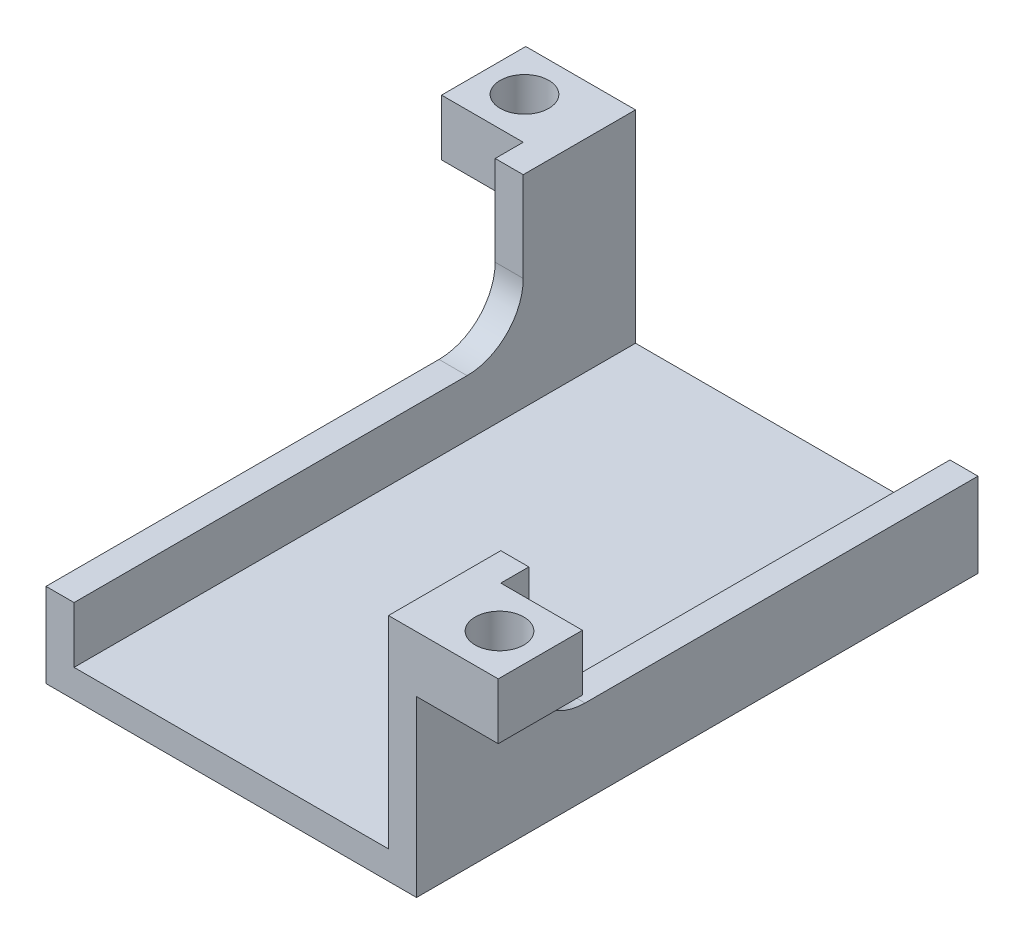
ISO-10303-21;
HEADER;
FILE_DESCRIPTION(('STEP AP214'),'2;1');
FILE_NAME('part.step','',(''),(''),'','','');
FILE_SCHEMA(('AUTOMOTIVE_DESIGN { 1 0 10303 214 1 1 1 1 }'));
ENDSEC;
DATA;
#1=APPLICATION_CONTEXT('core data for automotive mechanical design processes');
#2=APPLICATION_PROTOCOL_DEFINITION('international standard','automotive_design',2000,#1);
#3=PRODUCT_CONTEXT('',#1,'mechanical');
#4=PRODUCT('Part','Part','',(#3));
#5=PRODUCT_RELATED_PRODUCT_CATEGORY('part','',(#4));
#6=PRODUCT_DEFINITION_FORMATION('','',#4);
#7=PRODUCT_DEFINITION_CONTEXT('part definition',#1,'design');
#8=PRODUCT_DEFINITION('design','',#6,#7);
#9=PRODUCT_DEFINITION_SHAPE('','',#8);
#10=(LENGTH_UNIT() NAMED_UNIT(*) SI_UNIT(.MILLI.,.METRE.));
#11=(NAMED_UNIT(*) PLANE_ANGLE_UNIT() SI_UNIT($,.RADIAN.));
#12=(NAMED_UNIT(*) SI_UNIT($,.STERADIAN.) SOLID_ANGLE_UNIT());
#13=UNCERTAINTY_MEASURE_WITH_UNIT(LENGTH_MEASURE(1.E-05),#10,'distance_accuracy_value','');
#14=(GEOMETRIC_REPRESENTATION_CONTEXT(3) GLOBAL_UNCERTAINTY_ASSIGNED_CONTEXT((#13)) GLOBAL_UNIT_ASSIGNED_CONTEXT((#10,
#11,#12)) REPRESENTATION_CONTEXT('',''));
#15=CARTESIAN_POINT('',(0.,0.,0.));
#16=DIRECTION('',(0.,0.,1.));
#17=DIRECTION('',(1.,0.,0.));
#18=AXIS2_PLACEMENT_3D('',#15,#16,#17);
#19=CARTESIAN_POINT('',(-60.3852086140681,9.525,1.53965663599384E-13));
#20=DIRECTION('',(0.,1.,0.));
#21=DIRECTION('',(0.,0.,1.));
#22=AXIS2_PLACEMENT_3D('',#19,#20,#21);
#23=PLANE('',#22);
#24=DIRECTION('',(0.,0.,1.));
#25=VECTOR('',#24,1.);
#26=CARTESIAN_POINT('',(-39.4302086140683,9.525,-31.75));
#27=LINE('',#26,#25);
#28=CARTESIAN_POINT('',(-39.4302086140683,9.525,-31.75));
#29=VERTEX_POINT('',#28);
#30=CARTESIAN_POINT('',(-39.4302086140681,9.525,12.7));
#31=VERTEX_POINT('',#30);
#32=EDGE_CURVE('E318',#29,#31,#27,.T.);
#33=ORIENTED_EDGE('',*,*,#32,.F.);
#34=DIRECTION('',(1.,0.,0.));
#35=VECTOR('',#34,1.);
#36=CARTESIAN_POINT('',(-39.4302086140683,9.525,-31.75));
#37=LINE('',#36,#35);
#38=CARTESIAN_POINT('',(-42.6052086140683,9.525,-31.7499999999999));
#39=VERTEX_POINT('',#38);
#40=EDGE_CURVE('E325',#39,#29,#37,.T.);
#41=ORIENTED_EDGE('',*,*,#40,.F.);
#42=DIRECTION('',(0.,0.,-1.));
#43=VECTOR('',#42,1.);
#44=CARTESIAN_POINT('',(-42.6052086140683,9.525,-31.7499999999999));
#45=LINE('',#44,#43);
#46=CARTESIAN_POINT('',(-42.6052086140681,9.525,12.7000000000001));
#47=VERTEX_POINT('',#46);
#48=EDGE_CURVE('E322',#47,#39,#45,.T.);
#49=ORIENTED_EDGE('',*,*,#48,.F.);
#50=DIRECTION('',(1.,0.,0.));
#51=VECTOR('',#50,1.);
#52=CARTESIAN_POINT('',(-60.3852086140681,9.525,12.7000000000002));
#53=LINE('',#52,#51);
#54=EDGE_CURVE('E386',#31,#47,#53,.F.);
#55=ORIENTED_EDGE('',*,*,#54,.F.);
#56=EDGE_LOOP('',(#33,#41,#49,#55));
#57=FACE_BOUND('',#56,.T.);
#58=ADVANCED_FACE('F39',(#57),#23,.T.);
#59=CARTESIAN_POINT('',(-60.3852086140681,9.525,1.53965663599384E-13));
#60=DIRECTION('',(0.,-1.,0.));
#61=DIRECTION('',(0.,0.,-1.));
#62=AXIS2_PLACEMENT_3D('',#59,#60,#61);
#63=PLANE('',#62);
#64=DIRECTION('',(0.,0.,-1.));
#65=VECTOR('',#64,1.);
#66=CARTESIAN_POINT('',(-81.3402086140683,9.525,-31.7499999999997));
#67=LINE('',#66,#65);
#68=CARTESIAN_POINT('',(-81.340208614068,9.525,31.7500000000003));
#69=VERTEX_POINT('',#68);
#70=CARTESIAN_POINT('',(-81.3402086140682,9.525,-12.6999999999997));
#71=VERTEX_POINT('',#70);
#72=EDGE_CURVE('E296',#69,#71,#67,.T.);
#73=ORIENTED_EDGE('',*,*,#72,.F.);
#74=DIRECTION('',(-1.,0.,0.));
#75=VECTOR('',#74,1.);
#76=CARTESIAN_POINT('',(-81.340208614068,9.525,31.7500000000003));
#77=LINE('',#76,#75);
#78=CARTESIAN_POINT('',(-78.165208614068,9.525,31.7500000000002));
#79=VERTEX_POINT('',#78);
#80=EDGE_CURVE('E304',#79,#69,#77,.T.);
#81=ORIENTED_EDGE('',*,*,#80,.F.);
#82=DIRECTION('',(0.,0.,1.));
#83=VECTOR('',#82,1.);
#84=CARTESIAN_POINT('',(-78.1652086140683,9.525,-31.7499999999998));
#85=LINE('',#84,#83);
#86=CARTESIAN_POINT('',(-78.1652086140682,9.525,-12.6999999999998));
#87=VERTEX_POINT('',#86);
#88=EDGE_CURVE('E300',#87,#79,#85,.T.);
#89=ORIENTED_EDGE('',*,*,#88,.F.);
#90=DIRECTION('',(-1.,0.,0.));
#91=VECTOR('',#90,1.);
#92=CARTESIAN_POINT('',(-78.1652086140682,9.525,-12.6999999999998));
#93=LINE('',#92,#91);
#94=EDGE_CURVE('E379',#71,#87,#93,.F.);
#95=ORIENTED_EDGE('',*,*,#94,.F.);
#96=EDGE_LOOP('',(#73,#81,#89,#95));
#97=FACE_BOUND('',#96,.T.);
#98=ADVANCED_FACE('F432',(#97),#63,.F.);
#99=CARTESIAN_POINT('',(-60.3852086140681,3.175,1.53965663599384E-13));
#100=DIRECTION('',(0.,-1.,0.));
#101=DIRECTION('',(0.,0.,-1.));
#102=AXIS2_PLACEMENT_3D('',#99,#100,#101);
#103=PLANE('',#102);
#104=DIRECTION('',(0.,0.,1.));
#105=VECTOR('',#104,1.);
#106=CARTESIAN_POINT('',(-78.1652086140683,3.175,-31.7499999999998));
#107=LINE('',#106,#105);
#108=CARTESIAN_POINT('',(-78.1652086140683,3.175,-31.7499999999998));
#109=VERTEX_POINT('',#108);
#110=CARTESIAN_POINT('',(-78.165208614068,3.175,31.7500000000002));
#111=VERTEX_POINT('',#110);
#112=EDGE_CURVE('E295',#109,#111,#107,.T.);
#113=ORIENTED_EDGE('',*,*,#112,.T.);
#114=DIRECTION('',(-1.,0.,0.));
#115=VECTOR('',#114,1.);
#116=CARTESIAN_POINT('',(-39.430208614068,3.175,31.75));
#117=LINE('',#116,#115);
#118=CARTESIAN_POINT('',(-42.605208614068,3.175,31.7500000000001));
#119=VERTEX_POINT('',#118);
#120=EDGE_CURVE('E343',#119,#111,#117,.T.);
#121=ORIENTED_EDGE('',*,*,#120,.F.);
#122=DIRECTION('',(0.,0.,-1.));
#123=VECTOR('',#122,1.);
#124=CARTESIAN_POINT('',(-42.6052086140683,3.175,-31.7499999999999));
#125=LINE('',#124,#123);
#126=CARTESIAN_POINT('',(-42.6052086140683,3.175,-31.7499999999999));
#127=VERTEX_POINT('',#126);
#128=EDGE_CURVE('E317',#119,#127,#125,.T.);
#129=ORIENTED_EDGE('',*,*,#128,.T.);
#130=DIRECTION('',(1.,0.,0.));
#131=VECTOR('',#130,1.);
#132=CARTESIAN_POINT('',(-39.4302086140683,3.175,-31.75));
#133=LINE('',#132,#131);
#134=EDGE_CURVE('E339',#109,#127,#133,.T.);
#135=ORIENTED_EDGE('',*,*,#134,.F.);
#136=EDGE_LOOP('',(#113,#121,#129,#135));
#137=FACE_BOUND('',#136,.T.);
#138=ADVANCED_FACE('F438',(#137),#103,.F.);
#139=CARTESIAN_POINT('',(-81.340208614068,3.175,31.7500000000003));
#140=DIRECTION('',(1.,0.,0.));
#141=DIRECTION('',(0.,0.,1.));
#142=AXIS2_PLACEMENT_3D('',#139,#140,#141);
#143=PLANE('',#142);
#144=DIRECTION('',(0.,-1.,0.));
#145=VECTOR('',#144,1.);
#146=CARTESIAN_POINT('',(-81.3402086140683,3.175,-31.7499999999997));
#147=LINE('',#146,#145);
#148=CARTESIAN_POINT('',(-81.3402086140683,19.685,-31.7499999999997));
#149=VERTEX_POINT('',#148);
#150=CARTESIAN_POINT('',(-81.3402086140683,0.,-31.7499999999997));
#151=VERTEX_POINT('',#150);
#152=EDGE_CURVE('E372',#149,#151,#147,.T.);
#153=ORIENTED_EDGE('',*,*,#152,.T.);
#154=DIRECTION('',(0.,0.,-1.));
#155=VECTOR('',#154,1.);
#156=CARTESIAN_POINT('',(-81.340208614068,0.,31.7500000000003));
#157=LINE('',#156,#155);
#158=CARTESIAN_POINT('',(-81.340208614068,0.,31.7500000000003));
#159=VERTEX_POINT('',#158);
#160=EDGE_CURVE('E338',#159,#151,#157,.T.);
#161=ORIENTED_EDGE('',*,*,#160,.F.);
#162=DIRECTION('',(0.,-1.,0.));
#163=VECTOR('',#162,1.);
#164=CARTESIAN_POINT('',(-81.340208614068,3.175,31.7500000000003));
#165=LINE('',#164,#163);
#166=EDGE_CURVE('E348',#69,#159,#165,.T.);
#167=ORIENTED_EDGE('',*,*,#166,.F.);
#168=ORIENTED_EDGE('',*,*,#72,.T.);
#169=CARTESIAN_POINT('',(-81.3402086140682,15.875,-12.6999999999997));
#170=DIRECTION('',(-1.,0.,0.));
#171=DIRECTION('',(0.,0.,1.));
#172=AXIS2_PLACEMENT_3D('',#169,#170,#171);
#173=CIRCLE('',#172,6.35);
#174=CARTESIAN_POINT('',(-81.3402086140682,15.875,-19.0499999999997));
#175=VERTEX_POINT('',#174);
#176=EDGE_CURVE('E389',#175,#71,#173,.T.);
#177=ORIENTED_EDGE('',*,*,#176,.F.);
#178=DIRECTION('',(0.,-1.,0.));
#179=VECTOR('',#178,1.);
#180=CARTESIAN_POINT('',(-81.3402086140682,26.035,-19.0499999999997));
#181=LINE('',#180,#179);
#182=CARTESIAN_POINT('',(-81.3402086140682,26.035,-19.0499999999997));
#183=VERTEX_POINT('',#182);
#184=EDGE_CURVE('E287',#183,#175,#181,.T.);
#185=ORIENTED_EDGE('',*,*,#184,.F.);
#186=DIRECTION('',(0.,0.,-1.));
#187=VECTOR('',#186,1.);
#188=CARTESIAN_POINT('',(-81.3402086140683,26.035,-31.7499999999997));
#189=LINE('',#188,#187);
#190=CARTESIAN_POINT('',(-81.3402086140682,26.035,-22.2249999999997));
#191=VERTEX_POINT('',#190);
#192=EDGE_CURVE('E272',#183,#191,#189,.T.);
#193=ORIENTED_EDGE('',*,*,#192,.T.);
#194=DIRECTION('',(0.,1.,0.));
#195=VECTOR('',#194,1.);
#196=CARTESIAN_POINT('',(-81.3402086140682,19.685,-22.2249999999997));
#197=LINE('',#196,#195);
#198=CARTESIAN_POINT('',(-81.3402086140682,19.685,-22.2249999999997));
#199=VERTEX_POINT('',#198);
#200=EDGE_CURVE('E236',#199,#191,#197,.T.);
#201=ORIENTED_EDGE('',*,*,#200,.F.);
#202=DIRECTION('',(0.,0.,1.));
#203=VECTOR('',#202,1.);
#204=CARTESIAN_POINT('',(-81.3402086140683,19.685,-31.7499999999997));
#205=LINE('',#204,#203);
#206=EDGE_CURVE('E222',#149,#199,#205,.T.);
#207=ORIENTED_EDGE('',*,*,#206,.F.);
#208=EDGE_LOOP('',(#153,#161,#167,#168,#177,#185,#193,#201,#207));
#209=FACE_BOUND('',#208,.T.);
#210=ADVANCED_FACE('F451',(#209),#143,.F.);
#211=CARTESIAN_POINT('',(-39.4302086140683,3.175,-31.75));
#212=DIRECTION('',(0.,0.,1.));
#213=DIRECTION('',(-1.,0.,0.));
#214=AXIS2_PLACEMENT_3D('',#211,#212,#213);
#215=PLANE('',#214);
#216=DIRECTION('',(1.,0.,0.));
#217=VECTOR('',#216,1.);
#218=CARTESIAN_POINT('',(-39.4302086140683,0.,-31.75));
#219=LINE('',#218,#217);
#220=CARTESIAN_POINT('',(-39.4302086140683,0.,-31.75));
#221=VERTEX_POINT('',#220);
#222=EDGE_CURVE('E352',#151,#221,#219,.T.);
#223=ORIENTED_EDGE('',*,*,#222,.F.);
#224=ORIENTED_EDGE('',*,*,#152,.F.);
#225=DIRECTION('',(1.,0.,0.));
#226=VECTOR('',#225,1.);
#227=CARTESIAN_POINT('',(-81.3402086140683,19.685,-31.7499999999997));
#228=LINE('',#227,#226);
#229=CARTESIAN_POINT('',(-90.5778129211023,19.685,-31.7499999999997));
#230=VERTEX_POINT('',#229);
#231=EDGE_CURVE('E233',#230,#149,#228,.T.);
#232=ORIENTED_EDGE('',*,*,#231,.F.);
#233=DIRECTION('',(0.,1.,0.));
#234=VECTOR('',#233,1.);
#235=CARTESIAN_POINT('',(-90.5778129211023,19.685,-31.7499999999997));
#236=LINE('',#235,#234);
#237=CARTESIAN_POINT('',(-90.5778129211023,26.035,-31.7499999999997));
#238=VERTEX_POINT('',#237);
#239=EDGE_CURVE('E242',#230,#238,#236,.T.);
#240=ORIENTED_EDGE('',*,*,#239,.T.);
#241=DIRECTION('',(1.,0.,0.));
#242=VECTOR('',#241,1.);
#243=CARTESIAN_POINT('',(-81.3402086140683,26.035,-31.7499999999997));
#244=LINE('',#243,#242);
#245=CARTESIAN_POINT('',(-78.1652086140683,26.035,-31.7499999999998));
#246=VERTEX_POINT('',#245);
#247=EDGE_CURVE('E276',#238,#246,#244,.T.);
#248=ORIENTED_EDGE('',*,*,#247,.T.);
#249=DIRECTION('',(0.,-1.,0.));
#250=VECTOR('',#249,1.);
#251=CARTESIAN_POINT('',(-78.1652086140683,9.525,-31.7499999999998));
#252=LINE('',#251,#250);
#253=EDGE_CURVE('E314',#246,#109,#252,.T.);
#254=ORIENTED_EDGE('',*,*,#253,.T.);
#255=ORIENTED_EDGE('',*,*,#134,.T.);
#256=DIRECTION('',(0.,-1.,0.));
#257=VECTOR('',#256,1.);
#258=CARTESIAN_POINT('',(-42.6052086140683,9.525,-31.7499999999999));
#259=LINE('',#258,#257);
#260=EDGE_CURVE('E329',#39,#127,#259,.T.);
#261=ORIENTED_EDGE('',*,*,#260,.F.);
#262=ORIENTED_EDGE('',*,*,#40,.T.);
#263=DIRECTION('',(0.,-1.,0.));
#264=VECTOR('',#263,1.);
#265=CARTESIAN_POINT('',(-39.4302086140683,3.175,-31.75));
#266=LINE('',#265,#264);
#267=EDGE_CURVE('E368',#29,#221,#266,.T.);
#268=ORIENTED_EDGE('',*,*,#267,.T.);
#269=EDGE_LOOP('',(#223,#224,#232,#240,#248,#254,#255,#261,#262,#268));
#270=FACE_BOUND('',#269,.T.);
#271=ADVANCED_FACE('F461',(#270),#215,.F.);
#272=CARTESIAN_POINT('',(-39.430208614068,3.175,31.75));
#273=DIRECTION('',(-1.,0.,0.));
#274=DIRECTION('',(0.,0.,-1.));
#275=AXIS2_PLACEMENT_3D('',#272,#273,#274);
#276=PLANE('',#275);
#277=DIRECTION('',(0.,-1.,0.));
#278=VECTOR('',#277,1.);
#279=CARTESIAN_POINT('',(-39.430208614068,3.175,31.75));
#280=LINE('',#279,#278);
#281=CARTESIAN_POINT('',(-39.430208614068,19.685,31.75));
#282=VERTEX_POINT('',#281);
#283=CARTESIAN_POINT('',(-39.430208614068,0.,31.75));
#284=VERTEX_POINT('',#283);
#285=EDGE_CURVE('E365',#282,#284,#280,.T.);
#286=ORIENTED_EDGE('',*,*,#285,.T.);
#287=DIRECTION('',(0.,0.,1.));
#288=VECTOR('',#287,1.);
#289=CARTESIAN_POINT('',(-39.430208614068,0.,31.75));
#290=LINE('',#289,#288);
#291=EDGE_CURVE('E356',#221,#284,#290,.T.);
#292=ORIENTED_EDGE('',*,*,#291,.F.);
#293=ORIENTED_EDGE('',*,*,#267,.F.);
#294=ORIENTED_EDGE('',*,*,#32,.T.);
#295=CARTESIAN_POINT('',(-39.4302086140681,15.875,12.7));
#296=DIRECTION('',(1.,0.,0.));
#297=DIRECTION('',(0.,0.,-1.));
#298=AXIS2_PLACEMENT_3D('',#295,#296,#297);
#299=CIRCLE('',#298,6.35);
#300=CARTESIAN_POINT('',(-39.4302086140681,15.875,19.05));
#301=VERTEX_POINT('',#300);
#302=EDGE_CURVE('E48',#301,#31,#299,.T.);
#303=ORIENTED_EDGE('',*,*,#302,.F.);
#304=DIRECTION('',(0.,-1.,0.));
#305=VECTOR('',#304,1.);
#306=CARTESIAN_POINT('',(-39.4302086140681,26.035,19.05));
#307=LINE('',#306,#305);
#308=CARTESIAN_POINT('',(-39.4302086140681,26.035,19.05));
#309=VERTEX_POINT('',#308);
#310=EDGE_CURVE('E265',#309,#301,#307,.T.);
#311=ORIENTED_EDGE('',*,*,#310,.F.);
#312=DIRECTION('',(0.,0.,1.));
#313=VECTOR('',#312,1.);
#314=CARTESIAN_POINT('',(-39.430208614068,26.035,31.75));
#315=LINE('',#314,#313);
#316=CARTESIAN_POINT('',(-39.430208614068,26.035,22.225));
#317=VERTEX_POINT('',#316);
#318=EDGE_CURVE('E203',#309,#317,#315,.T.);
#319=ORIENTED_EDGE('',*,*,#318,.T.);
#320=DIRECTION('',(0.,1.,0.));
#321=VECTOR('',#320,1.);
#322=CARTESIAN_POINT('',(-39.430208614068,19.685,22.225));
#323=LINE('',#322,#321);
#324=CARTESIAN_POINT('',(-39.430208614068,19.685,22.225));
#325=VERTEX_POINT('',#324);
#326=EDGE_CURVE('E181',#325,#317,#323,.T.);
#327=ORIENTED_EDGE('',*,*,#326,.F.);
#328=DIRECTION('',(0.,0.,-1.));
#329=VECTOR('',#328,1.);
#330=CARTESIAN_POINT('',(-39.430208614068,19.685,31.75));
#331=LINE('',#330,#329);
#332=EDGE_CURVE('E188',#282,#325,#331,.T.);
#333=ORIENTED_EDGE('',*,*,#332,.F.);
#334=EDGE_LOOP('',(#286,#292,#293,#294,#303,#311,#319,#327,#333));
#335=FACE_BOUND('',#334,.T.);
#336=ADVANCED_FACE('F200',(#335),#276,.F.);
#337=CARTESIAN_POINT('',(-39.430208614068,3.175,31.75));
#338=DIRECTION('',(0.,0.,-1.));
#339=DIRECTION('',(1.,0.,0.));
#340=AXIS2_PLACEMENT_3D('',#337,#338,#339);
#341=PLANE('',#340);
#342=DIRECTION('',(-1.,0.,0.));
#343=VECTOR('',#342,1.);
#344=CARTESIAN_POINT('',(-39.430208614068,0.,31.75));
#345=LINE('',#344,#343);
#346=EDGE_CURVE('E344',#284,#159,#345,.T.);
#347=ORIENTED_EDGE('',*,*,#346,.F.);
#348=ORIENTED_EDGE('',*,*,#285,.F.);
#349=DIRECTION('',(-1.,0.,0.));
#350=VECTOR('',#349,1.);
#351=CARTESIAN_POINT('',(-39.430208614068,19.685,31.75));
#352=LINE('',#351,#350);
#353=CARTESIAN_POINT('',(-30.192604307034,19.685,31.75));
#354=VERTEX_POINT('',#353);
#355=EDGE_CURVE('E193',#354,#282,#352,.T.);
#356=ORIENTED_EDGE('',*,*,#355,.F.);
#357=DIRECTION('',(0.,1.,0.));
#358=VECTOR('',#357,1.);
#359=CARTESIAN_POINT('',(-30.192604307034,19.685,31.75));
#360=LINE('',#359,#358);
#361=CARTESIAN_POINT('',(-30.192604307034,26.035,31.75));
#362=VERTEX_POINT('',#361);
#363=EDGE_CURVE('E208',#354,#362,#360,.T.);
#364=ORIENTED_EDGE('',*,*,#363,.T.);
#365=DIRECTION('',(-1.,0.,0.));
#366=VECTOR('',#365,1.);
#367=CARTESIAN_POINT('',(-39.430208614068,26.035,31.75));
#368=LINE('',#367,#366);
#369=CARTESIAN_POINT('',(-42.605208614068,26.035,31.7500000000001));
#370=VERTEX_POINT('',#369);
#371=EDGE_CURVE('E254',#362,#370,#368,.T.);
#372=ORIENTED_EDGE('',*,*,#371,.T.);
#373=DIRECTION('',(0.,-1.,0.));
#374=VECTOR('',#373,1.);
#375=CARTESIAN_POINT('',(-42.605208614068,9.525,31.7500000000001));
#376=LINE('',#375,#374);
#377=EDGE_CURVE('E335',#370,#119,#376,.T.);
#378=ORIENTED_EDGE('',*,*,#377,.T.);
#379=ORIENTED_EDGE('',*,*,#120,.T.);
#380=DIRECTION('',(0.,-1.,0.));
#381=VECTOR('',#380,1.);
#382=CARTESIAN_POINT('',(-78.165208614068,9.525,31.7500000000002));
#383=LINE('',#382,#381);
#384=EDGE_CURVE('E308',#79,#111,#383,.T.);
#385=ORIENTED_EDGE('',*,*,#384,.F.);
#386=ORIENTED_EDGE('',*,*,#80,.T.);
#387=ORIENTED_EDGE('',*,*,#166,.T.);
#388=EDGE_LOOP('',(#347,#348,#356,#364,#372,#378,#379,#385,#386,#387));
#389=FACE_BOUND('',#388,.T.);
#390=ADVANCED_FACE('F455',(#389),#341,.F.);
#391=CARTESIAN_POINT('',(-60.3852086140681,0.,1.53965663599384E-13));
#392=DIRECTION('',(0.,-1.,0.));
#393=DIRECTION('',(0.,0.,-1.));
#394=AXIS2_PLACEMENT_3D('',#391,#392,#393);
#395=PLANE('',#394);
#396=ORIENTED_EDGE('',*,*,#160,.T.);
#397=ORIENTED_EDGE('',*,*,#222,.T.);
#398=ORIENTED_EDGE('',*,*,#291,.T.);
#399=ORIENTED_EDGE('',*,*,#346,.T.);
#400=EDGE_LOOP('',(#396,#397,#398,#399));
#401=FACE_BOUND('',#400,.T.);
#402=ADVANCED_FACE('F448',(#401),#395,.T.);
#403=CARTESIAN_POINT('',(-42.6052086140683,9.525,-31.7499999999999));
#404=DIRECTION('',(1.,0.,0.));
#405=DIRECTION('',(0.,0.,1.));
#406=AXIS2_PLACEMENT_3D('',#403,#404,#405);
#407=PLANE('',#406);
#408=ORIENTED_EDGE('',*,*,#128,.F.);
#409=ORIENTED_EDGE('',*,*,#377,.F.);
#410=DIRECTION('',(0.,0.,-1.));
#411=VECTOR('',#410,1.);
#412=CARTESIAN_POINT('',(-42.605208614068,26.035,31.7500000000001));
#413=LINE('',#412,#411);
#414=CARTESIAN_POINT('',(-42.605208614068,26.035,19.0500000000001));
#415=VERTEX_POINT('',#414);
#416=EDGE_CURVE('E258',#370,#415,#413,.T.);
#417=ORIENTED_EDGE('',*,*,#416,.T.);
#418=DIRECTION('',(0.,-1.,0.));
#419=VECTOR('',#418,1.);
#420=CARTESIAN_POINT('',(-42.605208614068,26.035,19.0500000000001));
#421=LINE('',#420,#419);
#422=CARTESIAN_POINT('',(-42.605208614068,15.875,19.0500000000001));
#423=VERTEX_POINT('',#422);
#424=EDGE_CURVE('E269',#415,#423,#421,.T.);
#425=ORIENTED_EDGE('',*,*,#424,.T.);
#426=CARTESIAN_POINT('',(-42.6052086140681,15.875,12.7000000000001));
#427=DIRECTION('',(-1.,0.,0.));
#428=DIRECTION('',(0.,0.,1.));
#429=AXIS2_PLACEMENT_3D('',#426,#427,#428);
#430=CIRCLE('',#429,6.35);
#431=EDGE_CURVE('E11',#47,#423,#430,.T.);
#432=ORIENTED_EDGE('',*,*,#431,.F.);
#433=ORIENTED_EDGE('',*,*,#48,.T.);
#434=ORIENTED_EDGE('',*,*,#260,.T.);
#435=EDGE_LOOP('',(#408,#409,#417,#425,#432,#433,#434));
#436=FACE_BOUND('',#435,.T.);
#437=ADVANCED_FACE('F445',(#436),#407,.F.);
#438=CARTESIAN_POINT('',(-78.1652086140683,9.525,-31.7499999999998));
#439=DIRECTION('',(-1.,0.,0.));
#440=DIRECTION('',(0.,0.,-1.));
#441=AXIS2_PLACEMENT_3D('',#438,#439,#440);
#442=PLANE('',#441);
#443=ORIENTED_EDGE('',*,*,#112,.F.);
#444=ORIENTED_EDGE('',*,*,#253,.F.);
#445=DIRECTION('',(0.,0.,1.));
#446=VECTOR('',#445,1.);
#447=CARTESIAN_POINT('',(-78.1652086140683,26.035,-31.7499999999998));
#448=LINE('',#447,#446);
#449=CARTESIAN_POINT('',(-78.1652086140682,26.035,-19.0499999999998));
#450=VERTEX_POINT('',#449);
#451=EDGE_CURVE('E280',#246,#450,#448,.T.);
#452=ORIENTED_EDGE('',*,*,#451,.T.);
#453=DIRECTION('',(0.,-1.,0.));
#454=VECTOR('',#453,1.);
#455=CARTESIAN_POINT('',(-78.1652086140682,26.035,-19.0499999999998));
#456=LINE('',#455,#454);
#457=CARTESIAN_POINT('',(-78.1652086140682,15.875,-19.0499999999998));
#458=VERTEX_POINT('',#457);
#459=EDGE_CURVE('E291',#450,#458,#456,.T.);
#460=ORIENTED_EDGE('',*,*,#459,.T.);
#461=CARTESIAN_POINT('',(-78.1652086140682,15.875,-12.6999999999998));
#462=DIRECTION('',(1.,0.,0.));
#463=DIRECTION('',(0.,0.,-1.));
#464=AXIS2_PLACEMENT_3D('',#461,#462,#463);
#465=CIRCLE('',#464,6.35);
#466=EDGE_CURVE('E392',#87,#458,#465,.T.);
#467=ORIENTED_EDGE('',*,*,#466,.F.);
#468=ORIENTED_EDGE('',*,*,#88,.T.);
#469=ORIENTED_EDGE('',*,*,#384,.T.);
#470=EDGE_LOOP('',(#443,#444,#452,#460,#467,#468,#469));
#471=FACE_BOUND('',#470,.T.);
#472=ADVANCED_FACE('F444',(#471),#442,.F.);
#473=CARTESIAN_POINT('',(-81.3402086140682,26.035,-19.0499999999997));
#474=DIRECTION('',(0.,0.,-1.));
#475=DIRECTION('',(1.,0.,0.));
#476=AXIS2_PLACEMENT_3D('',#473,#474,#475);
#477=PLANE('',#476);
#478=ORIENTED_EDGE('',*,*,#459,.F.);
#479=DIRECTION('',(-1.,0.,0.));
#480=VECTOR('',#479,1.);
#481=CARTESIAN_POINT('',(-81.3402086140682,26.035,-19.0499999999997));
#482=LINE('',#481,#480);
#483=EDGE_CURVE('E284',#450,#183,#482,.T.);
#484=ORIENTED_EDGE('',*,*,#483,.T.);
#485=ORIENTED_EDGE('',*,*,#184,.T.);
#486=DIRECTION('',(-1.,0.,0.));
#487=VECTOR('',#486,1.);
#488=CARTESIAN_POINT('',(-81.3402086140682,15.875,-19.0499999999997));
#489=LINE('',#488,#487);
#490=EDGE_CURVE('E376',#458,#175,#489,.T.);
#491=ORIENTED_EDGE('',*,*,#490,.F.);
#492=EDGE_LOOP('',(#478,#484,#485,#491));
#493=FACE_BOUND('',#492,.T.);
#494=ADVANCED_FACE('F479',(#493),#477,.F.);
#495=CARTESIAN_POINT('',(-60.3852086140681,26.035,1.53965663599384E-13));
#496=DIRECTION('',(0.,-1.,0.));
#497=DIRECTION('',(0.,0.,-1.));
#498=AXIS2_PLACEMENT_3D('',#495,#496,#497);
#499=PLANE('',#498);
#500=ORIENTED_EDGE('',*,*,#192,.F.);
#501=ORIENTED_EDGE('',*,*,#483,.F.);
#502=ORIENTED_EDGE('',*,*,#451,.F.);
#503=ORIENTED_EDGE('',*,*,#247,.F.);
#504=DIRECTION('',(0.,0.,-1.));
#505=VECTOR('',#504,1.);
#506=CARTESIAN_POINT('',(-90.5778129211023,26.035,-31.7499999999997));
#507=LINE('',#506,#505);
#508=CARTESIAN_POINT('',(-90.5778129211023,26.035,-22.2249999999997));
#509=VERTEX_POINT('',#508);
#510=EDGE_CURVE('E227',#509,#238,#507,.T.);
#511=ORIENTED_EDGE('',*,*,#510,.F.);
#512=DIRECTION('',(-1.,0.,0.));
#513=VECTOR('',#512,1.);
#514=CARTESIAN_POINT('',(-81.3402086140682,26.035,-22.2249999999997));
#515=LINE('',#514,#513);
#516=EDGE_CURVE('E217',#191,#509,#515,.T.);
#517=ORIENTED_EDGE('',*,*,#516,.F.);
#518=EDGE_LOOP('',(#500,#501,#502,#503,#511,#517));
#519=FACE_BOUND('',#518,.T.);
#520=CARTESIAN_POINT('',(-85.9590107675853,26.035,-26.9874999999997));
#521=DIRECTION('',(0.,-1.,0.));
#522=DIRECTION('',(0.,0.,1.));
#523=AXIS2_PLACEMENT_3D('',#520,#521,#522);
#524=CIRCLE('',#523,2.75);
#525=CARTESIAN_POINT('',(-85.9590107675853,26.035,-24.2374999999997));
#526=VERTEX_POINT('',#525);
#527=EDGE_CURVE('E218',#526,#526,#524,.T.);
#528=ORIENTED_EDGE('',*,*,#527,.T.);
#529=EDGE_LOOP('',(#528));
#530=FACE_BOUND('',#529,.T.);
#531=ADVANCED_FACE('F494',(#519,#530),#499,.F.);
#532=CARTESIAN_POINT('',(-39.4302086140681,26.035,19.05));
#533=DIRECTION('',(0.,0.,1.));
#534=DIRECTION('',(-1.,0.,0.));
#535=AXIS2_PLACEMENT_3D('',#532,#533,#534);
#536=PLANE('',#535);
#537=ORIENTED_EDGE('',*,*,#424,.F.);
#538=DIRECTION('',(1.,0.,0.));
#539=VECTOR('',#538,1.);
#540=CARTESIAN_POINT('',(-39.4302086140681,26.035,19.05));
#541=LINE('',#540,#539);
#542=EDGE_CURVE('E262',#415,#309,#541,.T.);
#543=ORIENTED_EDGE('',*,*,#542,.T.);
#544=ORIENTED_EDGE('',*,*,#310,.T.);
#545=DIRECTION('',(1.,0.,0.));
#546=VECTOR('',#545,1.);
#547=CARTESIAN_POINT('',(-39.4302086140681,15.875,19.05));
#548=LINE('',#547,#546);
#549=EDGE_CURVE('E383',#423,#301,#548,.T.);
#550=ORIENTED_EDGE('',*,*,#549,.F.);
#551=EDGE_LOOP('',(#537,#543,#544,#550));
#552=FACE_BOUND('',#551,.T.);
#553=ADVANCED_FACE('F510',(#552),#536,.F.);
#554=CARTESIAN_POINT('',(-60.3852086140681,26.035,1.53965663599384E-13));
#555=DIRECTION('',(0.,-1.,0.));
#556=DIRECTION('',(0.,0.,-1.));
#557=AXIS2_PLACEMENT_3D('',#554,#555,#556);
#558=PLANE('',#557);
#559=ORIENTED_EDGE('',*,*,#318,.F.);
#560=ORIENTED_EDGE('',*,*,#542,.F.);
#561=ORIENTED_EDGE('',*,*,#416,.F.);
#562=ORIENTED_EDGE('',*,*,#371,.F.);
#563=DIRECTION('',(0.,0.,1.));
#564=VECTOR('',#563,1.);
#565=CARTESIAN_POINT('',(-30.192604307034,26.035,31.75));
#566=LINE('',#565,#564);
#567=CARTESIAN_POINT('',(-30.192604307034,26.035,22.225));
#568=VERTEX_POINT('',#567);
#569=EDGE_CURVE('E198',#568,#362,#566,.T.);
#570=ORIENTED_EDGE('',*,*,#569,.F.);
#571=DIRECTION('',(1.,0.,0.));
#572=VECTOR('',#571,1.);
#573=CARTESIAN_POINT('',(-39.430208614068,26.035,22.225));
#574=LINE('',#573,#572);
#575=EDGE_CURVE('E403',#317,#568,#574,.T.);
#576=ORIENTED_EDGE('',*,*,#575,.F.);
#577=EDGE_LOOP('',(#559,#560,#561,#562,#570,#576));
#578=FACE_BOUND('',#577,.T.);
#579=CARTESIAN_POINT('',(-34.811406460551,26.035,26.9875));
#580=DIRECTION('',(0.,-1.,0.));
#581=DIRECTION('',(0.,0.,1.));
#582=AXIS2_PLACEMENT_3D('',#579,#580,#581);
#583=CIRCLE('',#582,2.75);
#584=CARTESIAN_POINT('',(-34.811406460551,26.035,29.7375));
#585=VERTEX_POINT('',#584);
#586=EDGE_CURVE('E409',#585,#585,#583,.T.);
#587=ORIENTED_EDGE('',*,*,#586,.T.);
#588=EDGE_LOOP('',(#587));
#589=FACE_BOUND('',#588,.T.);
#590=ADVANCED_FACE('F512',(#578,#589),#558,.F.);
#591=CARTESIAN_POINT('',(-90.5778129211023,19.685,-31.7499999999997));
#592=DIRECTION('',(-1.,0.,0.));
#593=DIRECTION('',(0.,0.,-1.));
#594=AXIS2_PLACEMENT_3D('',#591,#592,#593);
#595=PLANE('',#594);
#596=ORIENTED_EDGE('',*,*,#510,.T.);
#597=ORIENTED_EDGE('',*,*,#239,.F.);
#598=DIRECTION('',(0.,0.,-1.));
#599=VECTOR('',#598,1.);
#600=CARTESIAN_POINT('',(-90.5778129211023,19.685,-31.7499999999997));
#601=LINE('',#600,#599);
#602=CARTESIAN_POINT('',(-90.5778129211023,19.685,-22.2249999999997));
#603=VERTEX_POINT('',#602);
#604=EDGE_CURVE('E230',#603,#230,#601,.T.);
#605=ORIENTED_EDGE('',*,*,#604,.F.);
#606=DIRECTION('',(0.,1.,0.));
#607=VECTOR('',#606,1.);
#608=CARTESIAN_POINT('',(-90.5778129211023,19.685,-22.2249999999997));
#609=LINE('',#608,#607);
#610=EDGE_CURVE('E246',#603,#509,#609,.T.);
#611=ORIENTED_EDGE('',*,*,#610,.T.);
#612=EDGE_LOOP('',(#596,#597,#605,#611));
#613=FACE_BOUND('',#612,.T.);
#614=ADVANCED_FACE('F528',(#613),#595,.T.);
#615=CARTESIAN_POINT('',(-81.3402086140682,19.685,-22.2249999999997));
#616=DIRECTION('',(0.,0.,1.));
#617=DIRECTION('',(-1.,0.,0.));
#618=AXIS2_PLACEMENT_3D('',#615,#616,#617);
#619=PLANE('',#618);
#620=ORIENTED_EDGE('',*,*,#516,.T.);
#621=ORIENTED_EDGE('',*,*,#610,.F.);
#622=DIRECTION('',(-1.,0.,0.));
#623=VECTOR('',#622,1.);
#624=CARTESIAN_POINT('',(-81.3402086140682,19.685,-22.2249999999997));
#625=LINE('',#624,#623);
#626=EDGE_CURVE('E226',#199,#603,#625,.T.);
#627=ORIENTED_EDGE('',*,*,#626,.F.);
#628=ORIENTED_EDGE('',*,*,#200,.T.);
#629=EDGE_LOOP('',(#620,#621,#627,#628));
#630=FACE_BOUND('',#629,.T.);
#631=ADVANCED_FACE('F500',(#630),#619,.T.);
#632=CARTESIAN_POINT('',(-60.3852086140681,19.685,1.53965663599384E-13));
#633=DIRECTION('',(0.,1.,0.));
#634=DIRECTION('',(0.,0.,1.));
#635=AXIS2_PLACEMENT_3D('',#632,#633,#634);
#636=PLANE('',#635);
#637=CARTESIAN_POINT('',(-85.9590107675853,19.685,-26.9874999999997));
#638=DIRECTION('',(0.,-1.,0.));
#639=DIRECTION('',(0.,0.,1.));
#640=AXIS2_PLACEMENT_3D('',#637,#638,#639);
#641=CIRCLE('',#640,2.75);
#642=CARTESIAN_POINT('',(-85.9590107675853,19.685,-24.2374999999997));
#643=VERTEX_POINT('',#642);
#644=EDGE_CURVE('E213',#643,#643,#641,.T.);
#645=ORIENTED_EDGE('',*,*,#644,.F.);
#646=EDGE_LOOP('',(#645));
#647=FACE_BOUND('',#646,.T.);
#648=ORIENTED_EDGE('',*,*,#206,.T.);
#649=ORIENTED_EDGE('',*,*,#626,.T.);
#650=ORIENTED_EDGE('',*,*,#604,.T.);
#651=ORIENTED_EDGE('',*,*,#231,.T.);
#652=EDGE_LOOP('',(#648,#649,#650,#651));
#653=FACE_BOUND('',#652,.T.);
#654=ADVANCED_FACE('F504',(#647,#653),#636,.F.);
#655=CARTESIAN_POINT('',(-85.9590107675853,19.685,-26.9874999999997));
#656=DIRECTION('',(0.,1.,0.));
#657=DIRECTION('',(0.,0.,1.));
#658=AXIS2_PLACEMENT_3D('',#655,#656,#657);
#659=CYLINDRICAL_SURFACE('',#658,2.75);
#660=ORIENTED_EDGE('',*,*,#644,.T.);
#661=EDGE_LOOP('',(#660));
#662=FACE_BOUND('',#661,.T.);
#663=ORIENTED_EDGE('',*,*,#527,.F.);
#664=EDGE_LOOP('',(#663));
#665=FACE_BOUND('',#664,.T.);
#666=ADVANCED_FACE('F518',(#662,#665),#659,.F.);
#667=CARTESIAN_POINT('',(-30.192604307034,19.685,31.75));
#668=DIRECTION('',(1.,0.,0.));
#669=DIRECTION('',(0.,0.,1.));
#670=AXIS2_PLACEMENT_3D('',#667,#668,#669);
#671=PLANE('',#670);
#672=ORIENTED_EDGE('',*,*,#569,.T.);
#673=ORIENTED_EDGE('',*,*,#363,.F.);
#674=DIRECTION('',(0.,0.,1.));
#675=VECTOR('',#674,1.);
#676=CARTESIAN_POINT('',(-30.192604307034,19.685,31.75));
#677=LINE('',#676,#675);
#678=CARTESIAN_POINT('',(-30.192604307034,19.685,22.225));
#679=VERTEX_POINT('',#678);
#680=EDGE_CURVE('E187',#679,#354,#677,.T.);
#681=ORIENTED_EDGE('',*,*,#680,.F.);
#682=DIRECTION('',(0.,1.,0.));
#683=VECTOR('',#682,1.);
#684=CARTESIAN_POINT('',(-30.192604307034,19.685,22.225));
#685=LINE('',#684,#683);
#686=EDGE_CURVE('E183',#679,#568,#685,.T.);
#687=ORIENTED_EDGE('',*,*,#686,.T.);
#688=EDGE_LOOP('',(#672,#673,#681,#687));
#689=FACE_BOUND('',#688,.T.);
#690=ADVANCED_FACE('F428',(#689),#671,.T.);
#691=CARTESIAN_POINT('',(-39.430208614068,19.685,22.225));
#692=DIRECTION('',(0.,0.,-1.));
#693=DIRECTION('',(1.,0.,0.));
#694=AXIS2_PLACEMENT_3D('',#691,#692,#693);
#695=PLANE('',#694);
#696=ORIENTED_EDGE('',*,*,#575,.T.);
#697=ORIENTED_EDGE('',*,*,#686,.F.);
#698=DIRECTION('',(1.,0.,0.));
#699=VECTOR('',#698,1.);
#700=CARTESIAN_POINT('',(-39.430208614068,19.685,22.225));
#701=LINE('',#700,#699);
#702=EDGE_CURVE('E176',#325,#679,#701,.T.);
#703=ORIENTED_EDGE('',*,*,#702,.F.);
#704=ORIENTED_EDGE('',*,*,#326,.T.);
#705=EDGE_LOOP('',(#696,#697,#703,#704));
#706=FACE_BOUND('',#705,.T.);
#707=ADVANCED_FACE('F179',(#706),#695,.T.);
#708=CARTESIAN_POINT('',(-60.3852086140681,19.685,1.53965663599384E-13));
#709=DIRECTION('',(0.,1.,0.));
#710=DIRECTION('',(0.,0.,1.));
#711=AXIS2_PLACEMENT_3D('',#708,#709,#710);
#712=PLANE('',#711);
#713=CARTESIAN_POINT('',(-34.811406460551,19.685,26.9875));
#714=DIRECTION('',(0.,-1.,0.));
#715=DIRECTION('',(0.,0.,1.));
#716=AXIS2_PLACEMENT_3D('',#713,#714,#715);
#717=CIRCLE('',#716,2.75);
#718=CARTESIAN_POINT('',(-34.811406460551,19.685,29.7375));
#719=VERTEX_POINT('',#718);
#720=EDGE_CURVE('E405',#719,#719,#717,.T.);
#721=ORIENTED_EDGE('',*,*,#720,.F.);
#722=EDGE_LOOP('',(#721));
#723=FACE_BOUND('',#722,.T.);
#724=ORIENTED_EDGE('',*,*,#332,.T.);
#725=ORIENTED_EDGE('',*,*,#702,.T.);
#726=ORIENTED_EDGE('',*,*,#680,.T.);
#727=ORIENTED_EDGE('',*,*,#355,.T.);
#728=EDGE_LOOP('',(#724,#725,#726,#727));
#729=FACE_BOUND('',#728,.T.);
#730=ADVANCED_FACE('F191',(#723,#729),#712,.F.);
#731=CARTESIAN_POINT('',(-34.811406460551,19.685,26.9875));
#732=DIRECTION('',(0.,1.,0.));
#733=DIRECTION('',(0.,0.,1.));
#734=AXIS2_PLACEMENT_3D('',#731,#732,#733);
#735=CYLINDRICAL_SURFACE('',#734,2.75);
#736=ORIENTED_EDGE('',*,*,#720,.T.);
#737=EDGE_LOOP('',(#736));
#738=FACE_BOUND('',#737,.T.);
#739=ORIENTED_EDGE('',*,*,#586,.F.);
#740=EDGE_LOOP('',(#739));
#741=FACE_BOUND('',#740,.T.);
#742=ADVANCED_FACE('F417',(#738,#741),#735,.F.);
#743=CARTESIAN_POINT('',(-81.3402086140682,15.875,-12.6999999999997));
#744=DIRECTION('',(1.,0.,0.));
#745=DIRECTION('',(0.,0.,1.));
#746=AXIS2_PLACEMENT_3D('',#743,#744,#745);
#747=CYLINDRICAL_SURFACE('',#746,6.35);
#748=ORIENTED_EDGE('',*,*,#466,.T.);
#749=ORIENTED_EDGE('',*,*,#490,.T.);
#750=ORIENTED_EDGE('',*,*,#176,.T.);
#751=ORIENTED_EDGE('',*,*,#94,.T.);
#752=EDGE_LOOP('',(#748,#749,#750,#751));
#753=FACE_BOUND('',#752,.T.);
#754=ADVANCED_FACE('F426',(#753),#747,.F.);
#755=CARTESIAN_POINT('',(-39.4302086140681,15.875,12.7));
#756=DIRECTION('',(1.,0.,0.));
#757=DIRECTION('',(0.,0.,1.));
#758=AXIS2_PLACEMENT_3D('',#755,#756,#757);
#759=CYLINDRICAL_SURFACE('',#758,6.35);
#760=ORIENTED_EDGE('',*,*,#431,.T.);
#761=ORIENTED_EDGE('',*,*,#549,.T.);
#762=ORIENTED_EDGE('',*,*,#302,.T.);
#763=ORIENTED_EDGE('',*,*,#54,.T.);
#764=EDGE_LOOP('',(#760,#761,#762,#763));
#765=FACE_BOUND('',#764,.T.);
#766=ADVANCED_FACE('F41',(#765),#759,.F.);
#767=CLOSED_SHELL('',(#58,#98,#138,#210,#271,#336,#390,#402,#437,#472,#494,#531,#553,#590,#614,
#631,#654,#666,#690,#707,#730,#742,#754,#766));
#768=MANIFOLD_SOLID_BREP('B2',#767);
#769=ADVANCED_BREP_SHAPE_REPRESENTATION('',(#18,#768),#14);
#770=SHAPE_DEFINITION_REPRESENTATION(#9,#769);
ENDSEC;
END-ISO-10303-21;
